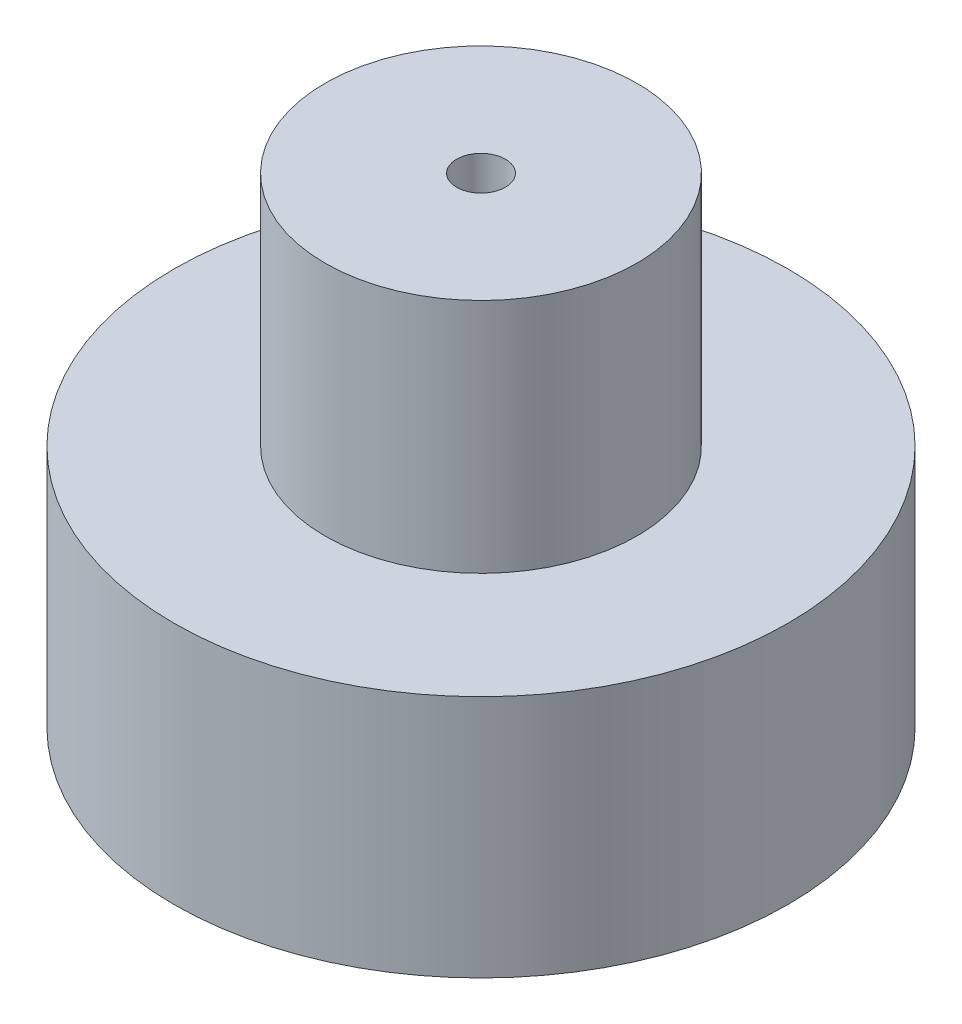
ISO-10303-21;
HEADER;
FILE_DESCRIPTION(('STEP AP214'),'2;1');
FILE_NAME('part.step','',(''),(''),'','','');
FILE_SCHEMA(('AUTOMOTIVE_DESIGN { 1 0 10303 214 1 1 1 1 }'));
ENDSEC;
DATA;
#1=APPLICATION_CONTEXT('core data for automotive mechanical design processes');
#2=APPLICATION_PROTOCOL_DEFINITION('international standard','automotive_design',2000,#1);
#3=PRODUCT_CONTEXT('',#1,'mechanical');
#4=PRODUCT('Part','Part','',(#3));
#5=PRODUCT_RELATED_PRODUCT_CATEGORY('part','',(#4));
#6=PRODUCT_DEFINITION_FORMATION('','',#4);
#7=PRODUCT_DEFINITION_CONTEXT('part definition',#1,'design');
#8=PRODUCT_DEFINITION('design','',#6,#7);
#9=PRODUCT_DEFINITION_SHAPE('','',#8);
#10=(LENGTH_UNIT() NAMED_UNIT(*) SI_UNIT(.MILLI.,.METRE.));
#11=(NAMED_UNIT(*) PLANE_ANGLE_UNIT() SI_UNIT($,.RADIAN.));
#12=(NAMED_UNIT(*) SI_UNIT($,.STERADIAN.) SOLID_ANGLE_UNIT());
#13=UNCERTAINTY_MEASURE_WITH_UNIT(LENGTH_MEASURE(1.E-05),#10,'distance_accuracy_value','');
#14=(GEOMETRIC_REPRESENTATION_CONTEXT(3) GLOBAL_UNCERTAINTY_ASSIGNED_CONTEXT((#13)) GLOBAL_UNIT_ASSIGNED_CONTEXT((#10,
#11,#12)) REPRESENTATION_CONTEXT('',''));
#15=CARTESIAN_POINT('',(0.,0.,0.));
#16=DIRECTION('',(0.,0.,1.));
#17=DIRECTION('',(1.,0.,0.));
#18=AXIS2_PLACEMENT_3D('',#15,#16,#17);
#19=CARTESIAN_POINT('',(0.,10.,0.));
#20=DIRECTION('',(0.,-1.,0.));
#21=DIRECTION('',(0.,0.,-1.));
#22=AXIS2_PLACEMENT_3D('',#19,#20,#21);
#23=CYLINDRICAL_SURFACE('',#22,12.6);
#24=CARTESIAN_POINT('',(0.,10.,0.));
#25=DIRECTION('',(0.,1.,0.));
#26=DIRECTION('',(0.,0.,1.));
#27=AXIS2_PLACEMENT_3D('',#24,#25,#26);
#28=CIRCLE('',#27,12.6);
#29=CARTESIAN_POINT('',(0.,10.,12.6));
#30=VERTEX_POINT('',#29);
#31=EDGE_CURVE('E44',#30,#30,#28,.T.);
#32=ORIENTED_EDGE('',*,*,#31,.F.);
#33=EDGE_LOOP('',(#32));
#34=FACE_BOUND('',#33,.T.);
#35=CARTESIAN_POINT('',(0.,0.,0.));
#36=DIRECTION('',(0.,1.,0.));
#37=DIRECTION('',(0.,0.,1.));
#38=AXIS2_PLACEMENT_3D('',#35,#36,#37);
#39=CIRCLE('',#38,12.6);
#40=CARTESIAN_POINT('',(0.,0.,12.6));
#41=VERTEX_POINT('',#40);
#42=EDGE_CURVE('E40',#41,#41,#39,.T.);
#43=ORIENTED_EDGE('',*,*,#42,.T.);
#44=EDGE_LOOP('',(#43));
#45=FACE_BOUND('',#44,.T.);
#46=ADVANCED_FACE('F37',(#34,#45),#23,.T.);
#47=CARTESIAN_POINT('',(0.,10.,0.));
#48=DIRECTION('',(0.,1.,0.));
#49=DIRECTION('',(0.,0.,1.));
#50=AXIS2_PLACEMENT_3D('',#47,#48,#49);
#51=PLANE('',#50);
#52=CARTESIAN_POINT('',(0.,10.,0.));
#53=DIRECTION('',(0.,1.,0.));
#54=DIRECTION('',(0.,0.,1.));
#55=AXIS2_PLACEMENT_3D('',#52,#53,#54);
#56=CIRCLE('',#55,6.39999999999999);
#57=CARTESIAN_POINT('',(0.,10.,6.39999999999999));
#58=VERTEX_POINT('',#57);
#59=EDGE_CURVE('E10',#58,#58,#56,.T.);
#60=ORIENTED_EDGE('',*,*,#59,.F.);
#61=EDGE_LOOP('',(#60));
#62=FACE_BOUND('',#61,.T.);
#63=ORIENTED_EDGE('',*,*,#31,.T.);
#64=EDGE_LOOP('',(#63));
#65=FACE_BOUND('',#64,.T.);
#66=ADVANCED_FACE('F75',(#62,#65),#51,.T.);
#67=CARTESIAN_POINT('',(0.,0.,0.));
#68=DIRECTION('',(0.,1.,0.));
#69=DIRECTION('',(0.,0.,1.));
#70=AXIS2_PLACEMENT_3D('',#67,#68,#69);
#71=PLANE('',#70);
#72=CARTESIAN_POINT('',(0.,0.,0.));
#73=DIRECTION('',(0.,1.,0.));
#74=DIRECTION('',(0.,0.,1.));
#75=AXIS2_PLACEMENT_3D('',#72,#73,#74);
#76=CIRCLE('',#75,0.999999999999995);
#77=CARTESIAN_POINT('',(0.,0.,0.999999999999995));
#78=VERTEX_POINT('',#77);
#79=EDGE_CURVE('E53',#78,#78,#76,.T.);
#80=ORIENTED_EDGE('',*,*,#79,.T.);
#81=EDGE_LOOP('',(#80));
#82=FACE_BOUND('',#81,.T.);
#83=ORIENTED_EDGE('',*,*,#42,.F.);
#84=EDGE_LOOP('',(#83));
#85=FACE_BOUND('',#84,.T.);
#86=ADVANCED_FACE('F70',(#82,#85),#71,.F.);
#87=CARTESIAN_POINT('',(0.,19.7,0.));
#88=DIRECTION('',(0.,-1.,0.));
#89=DIRECTION('',(0.,0.,-1.));
#90=AXIS2_PLACEMENT_3D('',#87,#88,#89);
#91=CYLINDRICAL_SURFACE('',#90,6.39999999999999);
#92=CARTESIAN_POINT('',(0.,19.7,0.));
#93=DIRECTION('',(0.,1.,0.));
#94=DIRECTION('',(0.,0.,1.));
#95=AXIS2_PLACEMENT_3D('',#92,#93,#94);
#96=CIRCLE('',#95,6.39999999999999);
#97=CARTESIAN_POINT('',(0.,19.7,6.39999999999999));
#98=VERTEX_POINT('',#97);
#99=EDGE_CURVE('E50',#98,#98,#96,.T.);
#100=ORIENTED_EDGE('',*,*,#99,.F.);
#101=EDGE_LOOP('',(#100));
#102=FACE_BOUND('',#101,.T.);
#103=ORIENTED_EDGE('',*,*,#59,.T.);
#104=EDGE_LOOP('',(#103));
#105=FACE_BOUND('',#104,.T.);
#106=ADVANCED_FACE('F65',(#102,#105),#91,.T.);
#107=CARTESIAN_POINT('',(0.,19.7,0.));
#108=DIRECTION('',(0.,1.,0.));
#109=DIRECTION('',(0.,0.,1.));
#110=AXIS2_PLACEMENT_3D('',#107,#108,#109);
#111=PLANE('',#110);
#112=CARTESIAN_POINT('',(0.,19.7,0.));
#113=DIRECTION('',(0.,1.,0.));
#114=DIRECTION('',(0.,0.,1.));
#115=AXIS2_PLACEMENT_3D('',#112,#113,#114);
#116=CIRCLE('',#115,0.999999999999987);
#117=CARTESIAN_POINT('',(0.,19.7,0.999999999999987));
#118=VERTEX_POINT('',#117);
#119=EDGE_CURVE('E56',#118,#118,#116,.T.);
#120=ORIENTED_EDGE('',*,*,#119,.F.);
#121=EDGE_LOOP('',(#120));
#122=FACE_BOUND('',#121,.T.);
#123=ORIENTED_EDGE('',*,*,#99,.T.);
#124=EDGE_LOOP('',(#123));
#125=FACE_BOUND('',#124,.T.);
#126=ADVANCED_FACE('F62',(#122,#125),#111,.T.);
#127=CARTESIAN_POINT('',(0.,19.7,0.));
#128=DIRECTION('',(0.,1.,0.));
#129=DIRECTION('',(0.,0.,1.));
#130=AXIS2_PLACEMENT_3D('',#127,#128,#129);
#131=CYLINDRICAL_SURFACE('',#130,0.999999999999991);
#132=ORIENTED_EDGE('',*,*,#79,.F.);
#133=EDGE_LOOP('',(#132));
#134=FACE_BOUND('',#133,.T.);
#135=ORIENTED_EDGE('',*,*,#119,.T.);
#136=EDGE_LOOP('',(#135));
#137=FACE_BOUND('',#136,.T.);
#138=ADVANCED_FACE('F60',(#134,#137),#131,.F.);
#139=CLOSED_SHELL('',(#46,#66,#86,#106,#126,#138));
#140=MANIFOLD_SOLID_BREP('B2',#139);
#141=ADVANCED_BREP_SHAPE_REPRESENTATION('',(#18,#140),#14);
#142=SHAPE_DEFINITION_REPRESENTATION(#9,#141);
ENDSEC;
END-ISO-10303-21;
